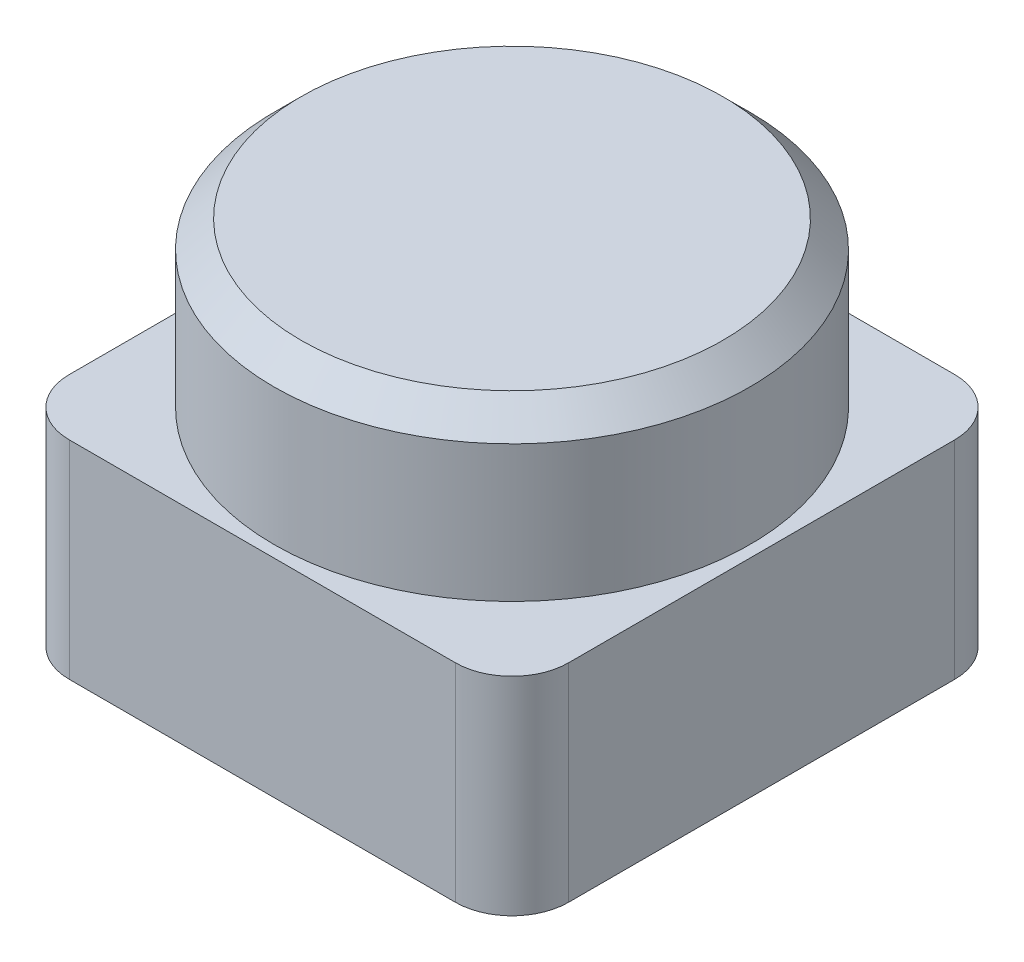
ISO-10303-21;
HEADER;
FILE_DESCRIPTION(('STEP AP214'),'2;1');
FILE_NAME('part.step','',(''),(''),'','','');
FILE_SCHEMA(('AUTOMOTIVE_DESIGN { 1 0 10303 214 1 1 1 1 }'));
ENDSEC;
DATA;
#1=APPLICATION_CONTEXT('core data for automotive mechanical design processes');
#2=APPLICATION_PROTOCOL_DEFINITION('international standard','automotive_design',2000,#1);
#3=PRODUCT_CONTEXT('',#1,'mechanical');
#4=PRODUCT('Part','Part','',(#3));
#5=PRODUCT_RELATED_PRODUCT_CATEGORY('part','',(#4));
#6=PRODUCT_DEFINITION_FORMATION('','',#4);
#7=PRODUCT_DEFINITION_CONTEXT('part definition',#1,'design');
#8=PRODUCT_DEFINITION('design','',#6,#7);
#9=PRODUCT_DEFINITION_SHAPE('','',#8);
#10=(LENGTH_UNIT() NAMED_UNIT(*) SI_UNIT(.MILLI.,.METRE.));
#11=(NAMED_UNIT(*) PLANE_ANGLE_UNIT() SI_UNIT($,.RADIAN.));
#12=(NAMED_UNIT(*) SI_UNIT($,.STERADIAN.) SOLID_ANGLE_UNIT());
#13=UNCERTAINTY_MEASURE_WITH_UNIT(LENGTH_MEASURE(1.E-05),#10,'distance_accuracy_value','');
#14=(GEOMETRIC_REPRESENTATION_CONTEXT(3) GLOBAL_UNCERTAINTY_ASSIGNED_CONTEXT((#13)) GLOBAL_UNIT_ASSIGNED_CONTEXT((#10,
#11,#12)) REPRESENTATION_CONTEXT('',''));
#15=CARTESIAN_POINT('',(0.,0.,0.));
#16=DIRECTION('',(0.,0.,1.));
#17=DIRECTION('',(1.,0.,0.));
#18=AXIS2_PLACEMENT_3D('',#15,#16,#17);
#19=CARTESIAN_POINT('',(0.,23.1,0.));
#20=DIRECTION('',(1.,0.,0.));
#21=DIRECTION('',(0.,0.,-1.));
#22=AXIS2_PLACEMENT_3D('',#19,#20,#21);
#23=PLANE('',#22);
#24=DIRECTION('',(0.,0.,1.));
#25=VECTOR('',#24,1.);
#26=CARTESIAN_POINT('',(0.,23.1,0.));
#27=LINE('',#26,#25);
#28=CARTESIAN_POINT('',(0.,23.1,-49.3));
#29=VERTEX_POINT('',#28);
#30=CARTESIAN_POINT('',(0.,23.1,-6.3));
#31=VERTEX_POINT('',#30);
#32=EDGE_CURVE('E137',#29,#31,#27,.T.);
#33=ORIENTED_EDGE('',*,*,#32,.F.);
#34=DIRECTION('',(0.,-1.,0.));
#35=VECTOR('',#34,1.);
#36=CARTESIAN_POINT('',(0.,23.1,-49.3));
#37=LINE('',#36,#35);
#38=CARTESIAN_POINT('',(0.,0.,-49.3));
#39=VERTEX_POINT('',#38);
#40=EDGE_CURVE('E163',#29,#39,#37,.T.);
#41=ORIENTED_EDGE('',*,*,#40,.T.);
#42=DIRECTION('',(0.,0.,1.));
#43=VECTOR('',#42,1.);
#44=CARTESIAN_POINT('',(0.,0.,0.));
#45=LINE('',#44,#43);
#46=CARTESIAN_POINT('',(0.,0.,-6.3));
#47=VERTEX_POINT('',#46);
#48=EDGE_CURVE('E200',#39,#47,#45,.T.);
#49=ORIENTED_EDGE('',*,*,#48,.T.);
#50=DIRECTION('',(0.,-1.,0.));
#51=VECTOR('',#50,1.);
#52=CARTESIAN_POINT('',(0.,23.1,-6.3));
#53=LINE('',#52,#51);
#54=EDGE_CURVE('E161',#47,#31,#53,.F.);
#55=ORIENTED_EDGE('',*,*,#54,.T.);
#56=EDGE_LOOP('',(#33,#41,#49,#55));
#57=FACE_BOUND('',#56,.T.);
#58=ADVANCED_FACE('F43',(#57),#23,.F.);
#59=CARTESIAN_POINT('',(0.,23.1,0.));
#60=DIRECTION('',(0.,0.,-1.));
#61=DIRECTION('',(-1.,0.,0.));
#62=AXIS2_PLACEMENT_3D('',#59,#60,#61);
#63=PLANE('',#62);
#64=DIRECTION('',(1.,0.,0.));
#65=VECTOR('',#64,1.);
#66=CARTESIAN_POINT('',(0.,23.1,0.));
#67=LINE('',#66,#65);
#68=CARTESIAN_POINT('',(6.3,23.1,0.));
#69=VERTEX_POINT('',#68);
#70=CARTESIAN_POINT('',(49.3,23.1,0.));
#71=VERTEX_POINT('',#70);
#72=EDGE_CURVE('E140',#69,#71,#67,.T.);
#73=ORIENTED_EDGE('',*,*,#72,.F.);
#74=DIRECTION('',(0.,-1.,0.));
#75=VECTOR('',#74,1.);
#76=CARTESIAN_POINT('',(6.3,23.1,0.));
#77=LINE('',#76,#75);
#78=CARTESIAN_POINT('',(6.3,0.,0.));
#79=VERTEX_POINT('',#78);
#80=EDGE_CURVE('E167',#69,#79,#77,.T.);
#81=ORIENTED_EDGE('',*,*,#80,.T.);
#82=DIRECTION('',(1.,0.,0.));
#83=VECTOR('',#82,1.);
#84=CARTESIAN_POINT('',(0.,0.,0.));
#85=LINE('',#84,#83);
#86=CARTESIAN_POINT('',(49.3,0.,0.));
#87=VERTEX_POINT('',#86);
#88=EDGE_CURVE('E142',#79,#87,#85,.T.);
#89=ORIENTED_EDGE('',*,*,#88,.T.);
#90=DIRECTION('',(0.,-1.,0.));
#91=VECTOR('',#90,1.);
#92=CARTESIAN_POINT('',(49.3,23.1,0.));
#93=LINE('',#92,#91);
#94=EDGE_CURVE('E59',#87,#71,#93,.F.);
#95=ORIENTED_EDGE('',*,*,#94,.T.);
#96=EDGE_LOOP('',(#73,#81,#89,#95));
#97=FACE_BOUND('',#96,.T.);
#98=ADVANCED_FACE('F210',(#97),#63,.F.);
#99=CARTESIAN_POINT('',(55.6,23.1,0.));
#100=DIRECTION('',(-1.,0.,0.));
#101=DIRECTION('',(0.,0.,1.));
#102=AXIS2_PLACEMENT_3D('',#99,#100,#101);
#103=PLANE('',#102);
#104=DIRECTION('',(0.,0.,-1.));
#105=VECTOR('',#104,1.);
#106=CARTESIAN_POINT('',(55.6,0.,0.));
#107=LINE('',#106,#105);
#108=CARTESIAN_POINT('',(55.6,0.,-6.3));
#109=VERTEX_POINT('',#108);
#110=CARTESIAN_POINT('',(55.6,0.,-49.3));
#111=VERTEX_POINT('',#110);
#112=EDGE_CURVE('E138',#109,#111,#107,.T.);
#113=ORIENTED_EDGE('',*,*,#112,.T.);
#114=DIRECTION('',(0.,-1.,0.));
#115=VECTOR('',#114,1.);
#116=CARTESIAN_POINT('',(55.6,23.1,-49.3));
#117=LINE('',#116,#115);
#118=CARTESIAN_POINT('',(55.6,23.1,-49.3));
#119=VERTEX_POINT('',#118);
#120=EDGE_CURVE('E116',#111,#119,#117,.F.);
#121=ORIENTED_EDGE('',*,*,#120,.T.);
#122=DIRECTION('',(0.,0.,-1.));
#123=VECTOR('',#122,1.);
#124=CARTESIAN_POINT('',(55.6,23.1,0.));
#125=LINE('',#124,#123);
#126=CARTESIAN_POINT('',(55.6,23.1,-6.3));
#127=VERTEX_POINT('',#126);
#128=EDGE_CURVE('E204',#127,#119,#125,.T.);
#129=ORIENTED_EDGE('',*,*,#128,.F.);
#130=DIRECTION('',(0.,-1.,0.));
#131=VECTOR('',#130,1.);
#132=CARTESIAN_POINT('',(55.6,23.1,-6.3));
#133=LINE('',#132,#131);
#134=EDGE_CURVE('E121',#127,#109,#133,.T.);
#135=ORIENTED_EDGE('',*,*,#134,.T.);
#136=EDGE_LOOP('',(#113,#121,#129,#135));
#137=FACE_BOUND('',#136,.T.);
#138=ADVANCED_FACE('F219',(#137),#103,.F.);
#139=CARTESIAN_POINT('',(0.,23.1,-55.6));
#140=DIRECTION('',(0.,0.,1.));
#141=DIRECTION('',(1.,0.,0.));
#142=AXIS2_PLACEMENT_3D('',#139,#140,#141);
#143=PLANE('',#142);
#144=DIRECTION('',(-1.,0.,0.));
#145=VECTOR('',#144,1.);
#146=CARTESIAN_POINT('',(0.,23.1,-55.6));
#147=LINE('',#146,#145);
#148=CARTESIAN_POINT('',(49.3,23.1,-55.6));
#149=VERTEX_POINT('',#148);
#150=CARTESIAN_POINT('',(6.3,23.1,-55.6));
#151=VERTEX_POINT('',#150);
#152=EDGE_CURVE('E131',#149,#151,#147,.T.);
#153=ORIENTED_EDGE('',*,*,#152,.F.);
#154=DIRECTION('',(0.,-1.,0.));
#155=VECTOR('',#154,1.);
#156=CARTESIAN_POINT('',(49.3,23.1,-55.6));
#157=LINE('',#156,#155);
#158=CARTESIAN_POINT('',(49.3,0.,-55.6));
#159=VERTEX_POINT('',#158);
#160=EDGE_CURVE('E115',#149,#159,#157,.T.);
#161=ORIENTED_EDGE('',*,*,#160,.T.);
#162=DIRECTION('',(-1.,0.,0.));
#163=VECTOR('',#162,1.);
#164=CARTESIAN_POINT('',(0.,0.,-55.6));
#165=LINE('',#164,#163);
#166=CARTESIAN_POINT('',(6.3,0.,-55.6));
#167=VERTEX_POINT('',#166);
#168=EDGE_CURVE('E128',#159,#167,#165,.T.);
#169=ORIENTED_EDGE('',*,*,#168,.T.);
#170=DIRECTION('',(0.,-1.,0.));
#171=VECTOR('',#170,1.);
#172=CARTESIAN_POINT('',(6.3,23.1,-55.6));
#173=LINE('',#172,#171);
#174=EDGE_CURVE('E133',#167,#151,#173,.F.);
#175=ORIENTED_EDGE('',*,*,#174,.T.);
#176=EDGE_LOOP('',(#153,#161,#169,#175));
#177=FACE_BOUND('',#176,.T.);
#178=ADVANCED_FACE('F127',(#177),#143,.F.);
#179=CARTESIAN_POINT('',(0.,23.1,0.));
#180=DIRECTION('',(0.,-1.,0.));
#181=DIRECTION('',(0.,0.,-1.));
#182=AXIS2_PLACEMENT_3D('',#179,#180,#181);
#183=PLANE('',#182);
#184=CARTESIAN_POINT('',(27.8,23.1,-27.8));
#185=DIRECTION('',(0.,1.,0.));
#186=DIRECTION('',(0.,0.,1.));
#187=AXIS2_PLACEMENT_3D('',#184,#185,#186);
#188=CIRCLE('',#187,26.5);
#189=CARTESIAN_POINT('',(27.8,23.1,-1.3));
#190=VERTEX_POINT('',#189);
#191=EDGE_CURVE('E169',#190,#190,#188,.T.);
#192=ORIENTED_EDGE('',*,*,#191,.F.);
#193=EDGE_LOOP('',(#192));
#194=FACE_BOUND('',#193,.T.);
#195=ORIENTED_EDGE('',*,*,#128,.T.);
#196=CARTESIAN_POINT('',(49.3,23.1,-49.3));
#197=DIRECTION('',(0.,-1.,0.));
#198=DIRECTION('',(0.,0.,-1.));
#199=AXIS2_PLACEMENT_3D('',#196,#197,#198);
#200=CIRCLE('',#199,6.3);
#201=EDGE_CURVE('E159',#119,#149,#200,.F.);
#202=ORIENTED_EDGE('',*,*,#201,.T.);
#203=ORIENTED_EDGE('',*,*,#152,.T.);
#204=CARTESIAN_POINT('',(6.3,23.1,-49.3));
#205=DIRECTION('',(0.,-1.,0.));
#206=DIRECTION('',(0.,0.,-1.));
#207=AXIS2_PLACEMENT_3D('',#204,#205,#206);
#208=CIRCLE('',#207,6.3);
#209=EDGE_CURVE('E157',#151,#29,#208,.F.);
#210=ORIENTED_EDGE('',*,*,#209,.T.);
#211=ORIENTED_EDGE('',*,*,#32,.T.);
#212=CARTESIAN_POINT('',(6.3,23.1,-6.3));
#213=DIRECTION('',(0.,-1.,0.));
#214=DIRECTION('',(0.,0.,-1.));
#215=AXIS2_PLACEMENT_3D('',#212,#213,#214);
#216=CIRCLE('',#215,6.3);
#217=EDGE_CURVE('E66',#31,#69,#216,.F.);
#218=ORIENTED_EDGE('',*,*,#217,.T.);
#219=ORIENTED_EDGE('',*,*,#72,.T.);
#220=CARTESIAN_POINT('',(49.3,23.1,-6.3));
#221=DIRECTION('',(0.,-1.,0.));
#222=DIRECTION('',(0.,0.,-1.));
#223=AXIS2_PLACEMENT_3D('',#220,#221,#222);
#224=CIRCLE('',#223,6.3);
#225=EDGE_CURVE('E154',#71,#127,#224,.F.);
#226=ORIENTED_EDGE('',*,*,#225,.T.);
#227=EDGE_LOOP('',(#195,#202,#203,#210,#211,#218,#219,#226));
#228=FACE_BOUND('',#227,.T.);
#229=ADVANCED_FACE('F217',(#194,#228),#183,.F.);
#230=CARTESIAN_POINT('',(0.,0.,0.));
#231=DIRECTION('',(0.,-1.,0.));
#232=DIRECTION('',(0.,0.,-1.));
#233=AXIS2_PLACEMENT_3D('',#230,#231,#232);
#234=PLANE('',#233);
#235=CARTESIAN_POINT('',(6.3,0.,-49.3));
#236=DIRECTION('',(0.,-1.,0.));
#237=DIRECTION('',(0.,0.,-1.));
#238=AXIS2_PLACEMENT_3D('',#235,#236,#237);
#239=CIRCLE('',#238,1.25);
#240=CARTESIAN_POINT('',(6.3,0.,-50.55));
#241=VERTEX_POINT('',#240);
#242=EDGE_CURVE('E191',#241,#241,#239,.T.);
#243=ORIENTED_EDGE('',*,*,#242,.F.);
#244=EDGE_LOOP('',(#243));
#245=FACE_BOUND('',#244,.T.);
#246=CARTESIAN_POINT('',(49.3,0.,-49.3));
#247=DIRECTION('',(0.,-1.,0.));
#248=DIRECTION('',(0.,0.,-1.));
#249=AXIS2_PLACEMENT_3D('',#246,#247,#248);
#250=CIRCLE('',#249,1.25);
#251=CARTESIAN_POINT('',(49.3,0.,-50.55));
#252=VERTEX_POINT('',#251);
#253=EDGE_CURVE('E185',#252,#252,#250,.T.);
#254=ORIENTED_EDGE('',*,*,#253,.F.);
#255=EDGE_LOOP('',(#254));
#256=FACE_BOUND('',#255,.T.);
#257=CARTESIAN_POINT('',(49.3,0.,-6.3));
#258=DIRECTION('',(0.,-1.,0.));
#259=DIRECTION('',(0.,0.,-1.));
#260=AXIS2_PLACEMENT_3D('',#257,#258,#259);
#261=CIRCLE('',#260,1.25);
#262=CARTESIAN_POINT('',(49.3,0.,-7.55));
#263=VERTEX_POINT('',#262);
#264=EDGE_CURVE('E178',#263,#263,#261,.T.);
#265=ORIENTED_EDGE('',*,*,#264,.F.);
#266=EDGE_LOOP('',(#265));
#267=FACE_BOUND('',#266,.T.);
#268=CARTESIAN_POINT('',(6.3,0.,-6.3));
#269=DIRECTION('',(0.,-1.,0.));
#270=DIRECTION('',(0.,0.,-1.));
#271=AXIS2_PLACEMENT_3D('',#268,#269,#270);
#272=CIRCLE('',#271,1.25);
#273=CARTESIAN_POINT('',(6.3,0.,-7.55));
#274=VERTEX_POINT('',#273);
#275=EDGE_CURVE('E181',#274,#274,#272,.T.);
#276=ORIENTED_EDGE('',*,*,#275,.F.);
#277=EDGE_LOOP('',(#276));
#278=FACE_BOUND('',#277,.T.);
#279=ORIENTED_EDGE('',*,*,#168,.F.);
#280=CARTESIAN_POINT('',(49.3,0.,-49.3));
#281=DIRECTION('',(0.,-1.,0.));
#282=DIRECTION('',(0.,0.,-1.));
#283=AXIS2_PLACEMENT_3D('',#280,#281,#282);
#284=CIRCLE('',#283,6.3);
#285=EDGE_CURVE('E111',#159,#111,#284,.T.);
#286=ORIENTED_EDGE('',*,*,#285,.T.);
#287=ORIENTED_EDGE('',*,*,#112,.F.);
#288=CARTESIAN_POINT('',(49.3,0.,-6.3));
#289=DIRECTION('',(0.,-1.,0.));
#290=DIRECTION('',(0.,0.,-1.));
#291=AXIS2_PLACEMENT_3D('',#288,#289,#290);
#292=CIRCLE('',#291,6.3);
#293=EDGE_CURVE('E132',#109,#87,#292,.T.);
#294=ORIENTED_EDGE('',*,*,#293,.T.);
#295=ORIENTED_EDGE('',*,*,#88,.F.);
#296=CARTESIAN_POINT('',(6.3,0.,-6.3));
#297=DIRECTION('',(0.,-1.,0.));
#298=DIRECTION('',(0.,0.,-1.));
#299=AXIS2_PLACEMENT_3D('',#296,#297,#298);
#300=CIRCLE('',#299,6.3);
#301=EDGE_CURVE('E148',#79,#47,#300,.T.);
#302=ORIENTED_EDGE('',*,*,#301,.T.);
#303=ORIENTED_EDGE('',*,*,#48,.F.);
#304=CARTESIAN_POINT('',(6.3,0.,-49.3));
#305=DIRECTION('',(0.,-1.,0.));
#306=DIRECTION('',(0.,0.,-1.));
#307=AXIS2_PLACEMENT_3D('',#304,#305,#306);
#308=CIRCLE('',#307,6.3);
#309=EDGE_CURVE('E122',#39,#167,#308,.T.);
#310=ORIENTED_EDGE('',*,*,#309,.T.);
#311=EDGE_LOOP('',(#279,#286,#287,#294,#295,#302,#303,#310));
#312=FACE_BOUND('',#311,.T.);
#313=ADVANCED_FACE('F135',(#245,#256,#267,#278,#312),#234,.T.);
#314=CARTESIAN_POINT('',(49.3,23.1,-49.3));
#315=DIRECTION('',(0.,-1.,0.));
#316=DIRECTION('',(0.,0.,-1.));
#317=AXIS2_PLACEMENT_3D('',#314,#315,#316);
#318=CYLINDRICAL_SURFACE('',#317,6.3);
#319=ORIENTED_EDGE('',*,*,#201,.F.);
#320=ORIENTED_EDGE('',*,*,#120,.F.);
#321=ORIENTED_EDGE('',*,*,#285,.F.);
#322=ORIENTED_EDGE('',*,*,#160,.F.);
#323=EDGE_LOOP('',(#319,#320,#321,#322));
#324=FACE_BOUND('',#323,.T.);
#325=ADVANCED_FACE('F114',(#324),#318,.T.);
#326=CARTESIAN_POINT('',(6.3,23.1,-49.3));
#327=DIRECTION('',(0.,-1.,0.));
#328=DIRECTION('',(0.,0.,-1.));
#329=AXIS2_PLACEMENT_3D('',#326,#327,#328);
#330=CYLINDRICAL_SURFACE('',#329,6.3);
#331=ORIENTED_EDGE('',*,*,#209,.F.);
#332=ORIENTED_EDGE('',*,*,#174,.F.);
#333=ORIENTED_EDGE('',*,*,#309,.F.);
#334=ORIENTED_EDGE('',*,*,#40,.F.);
#335=EDGE_LOOP('',(#331,#332,#333,#334));
#336=FACE_BOUND('',#335,.T.);
#337=ADVANCED_FACE('F237',(#336),#330,.T.);
#338=CARTESIAN_POINT('',(6.3,23.1,-6.3));
#339=DIRECTION('',(0.,-1.,0.));
#340=DIRECTION('',(0.,0.,-1.));
#341=AXIS2_PLACEMENT_3D('',#338,#339,#340);
#342=CYLINDRICAL_SURFACE('',#341,6.3);
#343=ORIENTED_EDGE('',*,*,#217,.F.);
#344=ORIENTED_EDGE('',*,*,#54,.F.);
#345=ORIENTED_EDGE('',*,*,#301,.F.);
#346=ORIENTED_EDGE('',*,*,#80,.F.);
#347=EDGE_LOOP('',(#343,#344,#345,#346));
#348=FACE_BOUND('',#347,.T.);
#349=ADVANCED_FACE('F240',(#348),#342,.T.);
#350=CARTESIAN_POINT('',(49.3,23.1,-6.3));
#351=DIRECTION('',(0.,-1.,0.));
#352=DIRECTION('',(0.,0.,-1.));
#353=AXIS2_PLACEMENT_3D('',#350,#351,#352);
#354=CYLINDRICAL_SURFACE('',#353,6.3);
#355=ORIENTED_EDGE('',*,*,#225,.F.);
#356=ORIENTED_EDGE('',*,*,#94,.F.);
#357=ORIENTED_EDGE('',*,*,#293,.F.);
#358=ORIENTED_EDGE('',*,*,#134,.F.);
#359=EDGE_LOOP('',(#355,#356,#357,#358));
#360=FACE_BOUND('',#359,.T.);
#361=ADVANCED_FACE('F214',(#360),#354,.T.);
#362=CARTESIAN_POINT('',(6.3,4.,-6.3));
#363=DIRECTION('',(0.,-1.,0.));
#364=DIRECTION('',(0.,0.,-1.));
#365=AXIS2_PLACEMENT_3D('',#362,#363,#364);
#366=CYLINDRICAL_SURFACE('',#365,1.25);
#367=CARTESIAN_POINT('',(6.3,4.,-6.3));
#368=DIRECTION('',(0.,-1.,0.));
#369=DIRECTION('',(0.,0.,-1.));
#370=AXIS2_PLACEMENT_3D('',#367,#368,#369);
#371=CIRCLE('',#370,1.25);
#372=CARTESIAN_POINT('',(6.3,4.,-7.55));
#373=VERTEX_POINT('',#372);
#374=EDGE_CURVE('E197',#373,#373,#371,.T.);
#375=ORIENTED_EDGE('',*,*,#374,.F.);
#376=EDGE_LOOP('',(#375));
#377=FACE_BOUND('',#376,.T.);
#378=ORIENTED_EDGE('',*,*,#275,.T.);
#379=EDGE_LOOP('',(#378));
#380=FACE_BOUND('',#379,.T.);
#381=ADVANCED_FACE('F245',(#377,#380),#366,.F.);
#382=CARTESIAN_POINT('',(6.3,4.,-6.3));
#383=DIRECTION('',(0.,-1.,0.));
#384=DIRECTION('',(0.,0.,-1.));
#385=AXIS2_PLACEMENT_3D('',#382,#383,#384);
#386=PLANE('',#385);
#387=ORIENTED_EDGE('',*,*,#374,.T.);
#388=EDGE_LOOP('',(#387));
#389=FACE_BOUND('',#388,.T.);
#390=ADVANCED_FACE('F250',(#389),#386,.T.);
#391=CARTESIAN_POINT('',(49.3,4.,-6.3));
#392=DIRECTION('',(0.,-1.,0.));
#393=DIRECTION('',(0.,0.,-1.));
#394=AXIS2_PLACEMENT_3D('',#391,#392,#393);
#395=CYLINDRICAL_SURFACE('',#394,1.25);
#396=CARTESIAN_POINT('',(49.3,4.,-6.3));
#397=DIRECTION('',(0.,-1.,0.));
#398=DIRECTION('',(0.,0.,-1.));
#399=AXIS2_PLACEMENT_3D('',#396,#397,#398);
#400=CIRCLE('',#399,1.25);
#401=CARTESIAN_POINT('',(49.3,4.,-7.55));
#402=VERTEX_POINT('',#401);
#403=EDGE_CURVE('E182',#402,#402,#400,.T.);
#404=ORIENTED_EDGE('',*,*,#403,.F.);
#405=EDGE_LOOP('',(#404));
#406=FACE_BOUND('',#405,.T.);
#407=ORIENTED_EDGE('',*,*,#264,.T.);
#408=EDGE_LOOP('',(#407));
#409=FACE_BOUND('',#408,.T.);
#410=ADVANCED_FACE('F256',(#406,#409),#395,.F.);
#411=CARTESIAN_POINT('',(49.3,4.,-6.3));
#412=DIRECTION('',(0.,-1.,0.));
#413=DIRECTION('',(0.,0.,-1.));
#414=AXIS2_PLACEMENT_3D('',#411,#412,#413);
#415=PLANE('',#414);
#416=ORIENTED_EDGE('',*,*,#403,.T.);
#417=EDGE_LOOP('',(#416));
#418=FACE_BOUND('',#417,.T.);
#419=ADVANCED_FACE('F278',(#418),#415,.T.);
#420=CARTESIAN_POINT('',(49.3,4.,-49.3));
#421=DIRECTION('',(0.,-1.,0.));
#422=DIRECTION('',(0.,0.,-1.));
#423=AXIS2_PLACEMENT_3D('',#420,#421,#422);
#424=CYLINDRICAL_SURFACE('',#423,1.25);
#425=CARTESIAN_POINT('',(49.3,4.,-49.3));
#426=DIRECTION('',(0.,-1.,0.));
#427=DIRECTION('',(0.,0.,-1.));
#428=AXIS2_PLACEMENT_3D('',#425,#426,#427);
#429=CIRCLE('',#428,1.25);
#430=CARTESIAN_POINT('',(49.3,4.,-50.55));
#431=VERTEX_POINT('',#430);
#432=EDGE_CURVE('E188',#431,#431,#429,.T.);
#433=ORIENTED_EDGE('',*,*,#432,.F.);
#434=EDGE_LOOP('',(#433));
#435=FACE_BOUND('',#434,.T.);
#436=ORIENTED_EDGE('',*,*,#253,.T.);
#437=EDGE_LOOP('',(#436));
#438=FACE_BOUND('',#437,.T.);
#439=ADVANCED_FACE('F284',(#435,#438),#424,.F.);
#440=CARTESIAN_POINT('',(49.3,4.,-49.3));
#441=DIRECTION('',(0.,-1.,0.));
#442=DIRECTION('',(0.,0.,-1.));
#443=AXIS2_PLACEMENT_3D('',#440,#441,#442);
#444=PLANE('',#443);
#445=ORIENTED_EDGE('',*,*,#432,.T.);
#446=EDGE_LOOP('',(#445));
#447=FACE_BOUND('',#446,.T.);
#448=ADVANCED_FACE('F294',(#447),#444,.T.);
#449=CARTESIAN_POINT('',(6.3,4.,-49.3));
#450=DIRECTION('',(0.,-1.,0.));
#451=DIRECTION('',(0.,0.,-1.));
#452=AXIS2_PLACEMENT_3D('',#449,#450,#451);
#453=CYLINDRICAL_SURFACE('',#452,1.25);
#454=CARTESIAN_POINT('',(6.3,4.,-49.3));
#455=DIRECTION('',(0.,-1.,0.));
#456=DIRECTION('',(0.,0.,-1.));
#457=AXIS2_PLACEMENT_3D('',#454,#455,#456);
#458=CIRCLE('',#457,1.25);
#459=CARTESIAN_POINT('',(6.3,4.,-50.55));
#460=VERTEX_POINT('',#459);
#461=EDGE_CURVE('E194',#460,#460,#458,.T.);
#462=ORIENTED_EDGE('',*,*,#461,.F.);
#463=EDGE_LOOP('',(#462));
#464=FACE_BOUND('',#463,.T.);
#465=ORIENTED_EDGE('',*,*,#242,.T.);
#466=EDGE_LOOP('',(#465));
#467=FACE_BOUND('',#466,.T.);
#468=ADVANCED_FACE('F298',(#464,#467),#453,.F.);
#469=CARTESIAN_POINT('',(6.3,4.,-49.3));
#470=DIRECTION('',(0.,-1.,0.));
#471=DIRECTION('',(0.,0.,-1.));
#472=AXIS2_PLACEMENT_3D('',#469,#470,#471);
#473=PLANE('',#472);
#474=ORIENTED_EDGE('',*,*,#461,.T.);
#475=EDGE_LOOP('',(#474));
#476=FACE_BOUND('',#475,.T.);
#477=ADVANCED_FACE('F301',(#476),#473,.T.);
#478=CARTESIAN_POINT('',(27.8,41.3,-27.8));
#479=DIRECTION('',(0.,-1.,0.));
#480=DIRECTION('',(0.,0.,-1.));
#481=AXIS2_PLACEMENT_3D('',#478,#479,#480);
#482=CYLINDRICAL_SURFACE('',#481,26.5);
#483=CARTESIAN_POINT('',(27.8,38.3,-27.8));
#484=DIRECTION('',(0.,1.,0.));
#485=DIRECTION('',(0.,0.,1.));
#486=AXIS2_PLACEMENT_3D('',#483,#484,#485);
#487=CIRCLE('',#486,26.5);
#488=CARTESIAN_POINT('',(27.8,38.3,-1.3));
#489=VERTEX_POINT('',#488);
#490=EDGE_CURVE('E11',#489,#489,#487,.F.);
#491=ORIENTED_EDGE('',*,*,#490,.T.);
#492=EDGE_LOOP('',(#491));
#493=FACE_BOUND('',#492,.T.);
#494=ORIENTED_EDGE('',*,*,#191,.T.);
#495=EDGE_LOOP('',(#494));
#496=FACE_BOUND('',#495,.T.);
#497=ADVANCED_FACE('F289',(#493,#496),#482,.T.);
#498=CARTESIAN_POINT('',(27.8,41.3,-27.8));
#499=DIRECTION('',(0.,1.,0.));
#500=DIRECTION('',(0.,0.,1.));
#501=AXIS2_PLACEMENT_3D('',#498,#499,#500);
#502=PLANE('',#501);
#503=CARTESIAN_POINT('',(27.8,41.3,-27.8));
#504=DIRECTION('',(0.,1.,0.));
#505=DIRECTION('',(0.,0.,1.));
#506=AXIS2_PLACEMENT_3D('',#503,#504,#505);
#507=CIRCLE('',#506,23.5);
#508=CARTESIAN_POINT('',(27.8,41.3,-4.30000000000001));
#509=VERTEX_POINT('',#508);
#510=EDGE_CURVE('E52',#509,#509,#507,.T.);
#511=ORIENTED_EDGE('',*,*,#510,.T.);
#512=EDGE_LOOP('',(#511));
#513=FACE_BOUND('',#512,.T.);
#514=ADVANCED_FACE('F308',(#513),#502,.T.);
#515=CARTESIAN_POINT('',(27.8,41.3,-27.8));
#516=DIRECTION('',(0.,-1.,0.));
#517=DIRECTION('',(0.,0.,-1.));
#518=AXIS2_PLACEMENT_3D('',#515,#516,#517);
#519=CONICAL_SURFACE('',#518,23.5,0.785398163397444);
#520=ORIENTED_EDGE('',*,*,#490,.F.);
#521=EDGE_LOOP('',(#520));
#522=FACE_BOUND('',#521,.T.);
#523=ORIENTED_EDGE('',*,*,#510,.F.);
#524=EDGE_LOOP('',(#523));
#525=FACE_BOUND('',#524,.T.);
#526=ADVANCED_FACE('F46',(#522,#525),#519,.T.);
#527=CLOSED_SHELL('',(#58,#98,#138,#178,#229,#313,#325,#337,#349,#361,#381,#390,#410,#419,#439,
#448,#468,#477,#497,#514,#526));
#528=MANIFOLD_SOLID_BREP('B2',#527);
#529=ADVANCED_BREP_SHAPE_REPRESENTATION('',(#18,#528),#14);
#530=SHAPE_DEFINITION_REPRESENTATION(#9,#529);
ENDSEC;
END-ISO-10303-21;
